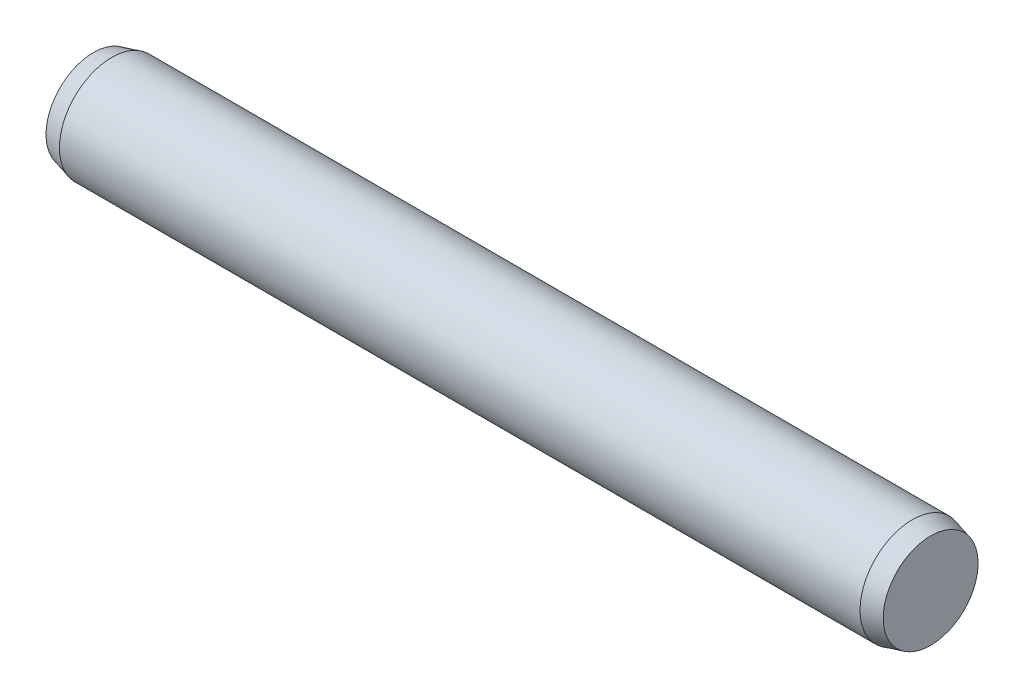
ISO-10303-21;
HEADER;
FILE_DESCRIPTION(('STEP AP214'),'2;1');
FILE_NAME('part.step','',(''),(''),'','','');
FILE_SCHEMA(('AUTOMOTIVE_DESIGN { 1 0 10303 214 1 1 1 1 }'));
ENDSEC;
DATA;
#1=APPLICATION_CONTEXT('core data for automotive mechanical design processes');
#2=APPLICATION_PROTOCOL_DEFINITION('international standard','automotive_design',2000,#1);
#3=PRODUCT_CONTEXT('',#1,'mechanical');
#4=PRODUCT('Part','Part','',(#3));
#5=PRODUCT_RELATED_PRODUCT_CATEGORY('part','',(#4));
#6=PRODUCT_DEFINITION_FORMATION('','',#4);
#7=PRODUCT_DEFINITION_CONTEXT('part definition',#1,'design');
#8=PRODUCT_DEFINITION('design','',#6,#7);
#9=PRODUCT_DEFINITION_SHAPE('','',#8);
#10=(LENGTH_UNIT() NAMED_UNIT(*) SI_UNIT(.MILLI.,.METRE.));
#11=(NAMED_UNIT(*) PLANE_ANGLE_UNIT() SI_UNIT($,.RADIAN.));
#12=(NAMED_UNIT(*) SI_UNIT($,.STERADIAN.) SOLID_ANGLE_UNIT());
#13=UNCERTAINTY_MEASURE_WITH_UNIT(LENGTH_MEASURE(1.E-05),#10,'distance_accuracy_value','');
#14=(GEOMETRIC_REPRESENTATION_CONTEXT(3) GLOBAL_UNCERTAINTY_ASSIGNED_CONTEXT((#13)) GLOBAL_UNIT_ASSIGNED_CONTEXT((#10,
#11,#12)) REPRESENTATION_CONTEXT('',''));
#15=CARTESIAN_POINT('',(0.,0.,0.));
#16=DIRECTION('',(0.,0.,1.));
#17=DIRECTION('',(1.,0.,0.));
#18=AXIS2_PLACEMENT_3D('',#15,#16,#17);
#19=CARTESIAN_POINT('',(0.,0.906217782649099,0.));
#20=DIRECTION('',(0.999999999999999,0.,0.));
#21=DIRECTION('',(0.,0.,-0.999999999999998));
#22=AXIS2_PLACEMENT_3D('',#19,#20,#21);
#23=PLANE('',#22);
#24=CARTESIAN_POINT('',(0.,0.,0.));
#25=DIRECTION('',(-0.999999999999999,0.,0.));
#26=DIRECTION('',(0.,0.,0.999999999999998));
#27=AXIS2_PLACEMENT_3D('',#24,#25,#26);
#28=CIRCLE('',#27,0.9062177826491);
#29=CARTESIAN_POINT('',(0.,0.,0.906217782649099));
#30=VERTEX_POINT('',#29);
#31=EDGE_CURVE('E60',#30,#30,#28,.T.);
#32=ORIENTED_EDGE('',*,*,#31,.T.);
#33=EDGE_LOOP('',(#32));
#34=FACE_BOUND('',#33,.T.);
#35=ADVANCED_FACE('F41',(#34),#23,.F.);
#36=CARTESIAN_POINT('',(16.,0.,0.));
#37=DIRECTION('',(-0.999999999999999,0.,0.));
#38=DIRECTION('',(0.,0.,0.999999999999998));
#39=AXIS2_PLACEMENT_3D('',#36,#37,#38);
#40=PLANE('',#39);
#41=CARTESIAN_POINT('',(16.,0.,0.));
#42=DIRECTION('',(-0.999999999999999,0.,0.));
#43=DIRECTION('',(0.,0.,0.999999999999998));
#44=AXIS2_PLACEMENT_3D('',#41,#42,#43);
#45=CIRCLE('',#44,0.90621778264911);
#46=CARTESIAN_POINT('',(16.,0.,0.906217782649108));
#47=VERTEX_POINT('',#46);
#48=EDGE_CURVE('E10',#47,#47,#45,.T.);
#49=ORIENTED_EDGE('',*,*,#48,.F.);
#50=EDGE_LOOP('',(#49));
#51=FACE_BOUND('',#50,.T.);
#52=ADVANCED_FACE('F82',(#51),#40,.F.);
#53=CARTESIAN_POINT('',(16.,0.,0.));
#54=DIRECTION('',(-0.999999999999999,0.,0.));
#55=DIRECTION('',(0.,0.,0.999999999999998));
#56=AXIS2_PLACEMENT_3D('',#53,#54,#55);
#57=CONICAL_SURFACE('',#56,0.90621778264911,0.261799387799147);
#58=CARTESIAN_POINT('',(15.65,0.,0.));
#59=DIRECTION('',(-0.999999999999999,0.,0.));
#60=DIRECTION('',(0.,0.,0.999999999999998));
#61=AXIS2_PLACEMENT_3D('',#58,#59,#60);
#62=CIRCLE('',#61,1.);
#63=CARTESIAN_POINT('',(15.65,0.,1.));
#64=VERTEX_POINT('',#63);
#65=EDGE_CURVE('E48',#64,#64,#62,.T.);
#66=CARTESIAN_POINT('',(15.65,0.,1.));
#67=CARTESIAN_POINT('',(15.6536458333333,0.,0.999023101902596));
#68=CARTESIAN_POINT('',(15.6572916666666,0.,0.998046203805191));
#69=CARTESIAN_POINT('',(15.6645833333333,0.,0.99609240761038));
#70=CARTESIAN_POINT('',(15.6682291666666,0.,0.995115509512975));
#71=CARTESIAN_POINT('',(15.6755208333333,0.,0.993161713318165));
#72=CARTESIAN_POINT('',(15.6791666666666,0.,0.99218481522076));
#73=CARTESIAN_POINT('',(15.6864583333333,0.,0.990231019025949));
#74=CARTESIAN_POINT('',(15.6901041666666,0.,0.989254120928544));
#75=CARTESIAN_POINT('',(15.6973958333333,0.,0.987300324733734));
#76=CARTESIAN_POINT('',(15.7010416666666,0.,0.986323426636329));
#77=CARTESIAN_POINT('',(15.7083333333333,0.,0.984369630441519));
#78=CARTESIAN_POINT('',(15.7119791666666,0.,0.983392732344114));
#79=CARTESIAN_POINT('',(15.7192708333333,0.,0.981438936149303));
#80=CARTESIAN_POINT('',(15.7229166666666,0.,0.980462038051898));
#81=CARTESIAN_POINT('',(15.7302083333333,0.,0.978508241857088));
#82=CARTESIAN_POINT('',(15.7338541666666,0.,0.977531343759683));
#83=CARTESIAN_POINT('',(15.7411458333333,0.,0.975577547564873));
#84=CARTESIAN_POINT('',(15.7447916666666,0.,0.974600649467467));
#85=CARTESIAN_POINT('',(15.7520833333333,0.,0.972646853272657));
#86=CARTESIAN_POINT('',(15.7557291666666,0.,0.971669955175252));
#87=CARTESIAN_POINT('',(15.7630208333333,0.,0.969716158980442));
#88=CARTESIAN_POINT('',(15.7666666666666,0.,0.968739260883036));
#89=CARTESIAN_POINT('',(15.7739583333333,0.,0.966785464688226));
#90=CARTESIAN_POINT('',(15.7776041666666,0.,0.965808566590821));
#91=CARTESIAN_POINT('',(15.7848958333333,0.,0.963854770396011));
#92=CARTESIAN_POINT('',(15.7885416666666,0.,0.962877872298605));
#93=CARTESIAN_POINT('',(15.7958333333333,0.,0.960924076103795));
#94=CARTESIAN_POINT('',(15.7994791666666,0.,0.95994717800639));
#95=CARTESIAN_POINT('',(15.8067708333333,0.,0.95799338181158));
#96=CARTESIAN_POINT('',(15.8104166666666,0.,0.957016483714175));
#97=CARTESIAN_POINT('',(15.8177083333333,0.,0.955062687519364));
#98=CARTESIAN_POINT('',(15.8213541666666,0.,0.954085789421959));
#99=CARTESIAN_POINT('',(15.8286458333333,0.,0.952131993227149));
#100=CARTESIAN_POINT('',(15.8322916666666,0.,0.951155095129744));
#101=CARTESIAN_POINT('',(15.8395833333333,0.,0.949201298934934));
#102=CARTESIAN_POINT('',(15.8432291666666,0.,0.948224400837528));
#103=CARTESIAN_POINT('',(15.8505208333333,0.,0.946270604642718));
#104=CARTESIAN_POINT('',(15.8541666666666,0.,0.945293706545313));
#105=CARTESIAN_POINT('',(15.8614583333333,0.,0.943339910350503));
#106=CARTESIAN_POINT('',(15.8651041666666,0.,0.942363012253098));
#107=CARTESIAN_POINT('',(15.8723958333333,0.,0.940409216058288));
#108=CARTESIAN_POINT('',(15.8760416666666,0.,0.939432317960882));
#109=CARTESIAN_POINT('',(15.8833333333333,0.,0.937478521766072));
#110=CARTESIAN_POINT('',(15.8869791666666,0.,0.936501623668667));
#111=CARTESIAN_POINT('',(15.8942708333333,0.,0.934547827473857));
#112=CARTESIAN_POINT('',(15.8979166666666,0.,0.933570929376451));
#113=CARTESIAN_POINT('',(15.9052083333333,0.,0.931617133181641));
#114=CARTESIAN_POINT('',(15.9088541666667,0.,0.930640235084236));
#115=CARTESIAN_POINT('',(15.9161458333333,0.,0.928686438889426));
#116=CARTESIAN_POINT('',(15.9197916666666,0.,0.927709540792021));
#117=CARTESIAN_POINT('',(15.9270833333333,0.,0.92575574459721));
#118=CARTESIAN_POINT('',(15.9307291666666,0.,0.924778846499805));
#119=CARTESIAN_POINT('',(15.9380208333333,0.,0.922825050304995));
#120=CARTESIAN_POINT('',(15.9416666666666,0.,0.92184815220759));
#121=CARTESIAN_POINT('',(15.9489583333333,0.,0.91989435601278));
#122=CARTESIAN_POINT('',(15.9526041666666,0.,0.918917457915375));
#123=CARTESIAN_POINT('',(15.9598958333333,0.,0.916963661720564));
#124=CARTESIAN_POINT('',(15.9635416666666,0.,0.915986763623159));
#125=CARTESIAN_POINT('',(15.9708333333333,0.,0.914032967428349));
#126=CARTESIAN_POINT('',(15.9744791666666,0.,0.913056069330944));
#127=CARTESIAN_POINT('',(15.9817708333333,0.,0.911102273136134));
#128=CARTESIAN_POINT('',(15.9854166666666,0.,0.910125375038728));
#129=CARTESIAN_POINT('',(15.9927083333333,0.,0.908171578843918));
#130=CARTESIAN_POINT('',(15.9963541666666,0.,0.907194680746513));
#131=CARTESIAN_POINT('',(16.,0.,0.906217782649108));
#132=B_SPLINE_CURVE_WITH_KNOTS('',3,(#66,#67,#68,#69,#70,#71,#72,#73,#74,#75,#76,#77,#78,#79,
#80,#81,#82,#83,#84,#85,#86,#87,#88,#89,#90,#91,#92,#93,#94,#95,#96,#97,#98,#99,#100,#101,#102,
#103,#104,#105,#106,#107,#108,#109,#110,#111,#112,#113,#114,#115,#116,#117,#118,#119,#120,#121,
#122,#123,#124,#125,#126,#127,#128,#129,#130,#131),.UNSPECIFIED.,.F.,.F.,(4,2,2,2,2,2,2,2,2,2,2,
2,2,2,2,2,2,2,2,2,2,2,2,2,2,2,2,2,2,2,2,2,4),(0.,0.0113233332232341,0.0226466664464682,
0.0339699996697057,0.0452933328929398,0.0566166661161739,0.0679399993394114,0.0792633325626455,
0.090586665785883,0.101909999009117,0.113233332232351,0.124556665455589,0.135879998678823,
0.147203331902057,0.158526665125294,0.169849998348529,0.181173331571766,0.192496664795,
0.203819998018234,0.215143331241472,0.226466664464706,0.23778999768794,0.249113330911177,
0.260436664134412,0.271759997357649,0.283083330580883,0.294406663804117,0.305729997027355,
0.317053330250589,0.328376663473823,0.33969999669706,0.351023329920295,0.362346663143529),.UNSPECIFIED.);
#133=EDGE_CURVE('BSEAM77',#64,#47,#132,.T.);
#134=ORIENTED_EDGE('',*,*,#65,.F.);
#135=ORIENTED_EDGE('',*,*,#48,.T.);
#136=ORIENTED_EDGE('',*,*,#133,.T.);
#137=ORIENTED_EDGE('',*,*,#133,.F.);
#138=EDGE_LOOP('',(#134,#136,#135,#137));
#139=FACE_BOUND('',#138,.T.);
#140=ADVANCED_FACE('F77',(#139),#57,.T.);
#141=CARTESIAN_POINT('',(-6.34999999999998,0.,0.));
#142=DIRECTION('',(-0.999999999999999,0.,0.));
#143=DIRECTION('',(0.,0.,0.999999999999998));
#144=AXIS2_PLACEMENT_3D('',#141,#142,#143);
#145=CYLINDRICAL_SURFACE('',#144,0.999999999999997);
#146=CARTESIAN_POINT('',(0.35,0.,0.));
#147=DIRECTION('',(-0.999999999999999,0.,0.));
#148=DIRECTION('',(0.,0.,0.999999999999998));
#149=AXIS2_PLACEMENT_3D('',#146,#147,#148);
#150=CIRCLE('',#149,0.999999999999991);
#151=CARTESIAN_POINT('',(0.35,0.,0.999999999999994));
#152=VERTEX_POINT('',#151);
#153=EDGE_CURVE('E54',#152,#152,#150,.T.);
#154=CARTESIAN_POINT('',(0.35,0.,0.999999999999994));
#155=CARTESIAN_POINT('',(0.509374999999999,0.,0.999999999999994));
#156=CARTESIAN_POINT('',(0.668749999999999,0.,0.999999999999994));
#157=CARTESIAN_POINT('',(0.987499999999998,0.,0.999999999999994));
#158=CARTESIAN_POINT('',(1.146875,0.,0.999999999999994));
#159=CARTESIAN_POINT('',(1.465625,0.,0.999999999999994));
#160=CARTESIAN_POINT('',(1.625,0.,0.999999999999994));
#161=CARTESIAN_POINT('',(1.94375,0.,0.999999999999994));
#162=CARTESIAN_POINT('',(2.103125,0.,0.999999999999994));
#163=CARTESIAN_POINT('',(2.421875,0.,0.999999999999994));
#164=CARTESIAN_POINT('',(2.58125,0.,0.999999999999994));
#165=CARTESIAN_POINT('',(2.9,0.,0.999999999999994));
#166=CARTESIAN_POINT('',(3.059375,0.,0.999999999999993));
#167=CARTESIAN_POINT('',(3.378125,0.,0.999999999999993));
#168=CARTESIAN_POINT('',(3.5375,0.,0.999999999999993));
#169=CARTESIAN_POINT('',(3.85625,0.,0.999999999999993));
#170=CARTESIAN_POINT('',(4.01562499999999,0.,0.999999999999993));
#171=CARTESIAN_POINT('',(4.33437499999999,0.,0.999999999999993));
#172=CARTESIAN_POINT('',(4.49374999999999,0.,0.999999999999993));
#173=CARTESIAN_POINT('',(4.81249999999999,0.,0.999999999999993));
#174=CARTESIAN_POINT('',(4.97187499999999,0.,0.999999999999993));
#175=CARTESIAN_POINT('',(5.29062499999999,0.,0.999999999999993));
#176=CARTESIAN_POINT('',(5.44999999999999,0.,0.999999999999993));
#177=CARTESIAN_POINT('',(5.76874999999999,0.,0.999999999999993));
#178=CARTESIAN_POINT('',(5.92812499999999,0.,0.999999999999993));
#179=CARTESIAN_POINT('',(6.24687499999999,0.,0.999999999999993));
#180=CARTESIAN_POINT('',(6.40624999999999,0.,0.999999999999993));
#181=CARTESIAN_POINT('',(6.72499999999999,0.,0.999999999999993));
#182=CARTESIAN_POINT('',(6.88437499999999,0.,0.999999999999993));
#183=CARTESIAN_POINT('',(7.20312499999999,0.,0.999999999999993));
#184=CARTESIAN_POINT('',(7.36249999999999,0.,0.999999999999993));
#185=CARTESIAN_POINT('',(7.68124999999999,0.,0.999999999999993));
#186=CARTESIAN_POINT('',(7.84062499999999,0.,0.999999999999993));
#187=CARTESIAN_POINT('',(8.15937499999999,0.,0.999999999999993));
#188=CARTESIAN_POINT('',(8.31874999999999,0.,0.999999999999992));
#189=CARTESIAN_POINT('',(8.63749999999999,0.,0.999999999999992));
#190=CARTESIAN_POINT('',(8.79687499999999,0.,0.999999999999992));
#191=CARTESIAN_POINT('',(9.11562499999999,0.,0.999999999999992));
#192=CARTESIAN_POINT('',(9.27499999999998,0.,0.999999999999992));
#193=CARTESIAN_POINT('',(9.59374999999998,0.,0.999999999999992));
#194=CARTESIAN_POINT('',(9.75312499999998,0.,0.999999999999992));
#195=CARTESIAN_POINT('',(10.071875,0.,0.999999999999992));
#196=CARTESIAN_POINT('',(10.23125,0.,0.999999999999992));
#197=CARTESIAN_POINT('',(10.55,0.,0.999999999999992));
#198=CARTESIAN_POINT('',(10.709375,0.,0.999999999999992));
#199=CARTESIAN_POINT('',(11.028125,0.,0.999999999999992));
#200=CARTESIAN_POINT('',(11.1875,0.,0.999999999999992));
#201=CARTESIAN_POINT('',(11.50625,0.,0.999999999999992));
#202=CARTESIAN_POINT('',(11.665625,0.,0.999999999999992));
#203=CARTESIAN_POINT('',(11.984375,0.,0.999999999999992));
#204=CARTESIAN_POINT('',(12.14375,0.,0.999999999999992));
#205=CARTESIAN_POINT('',(12.4625,0.,0.999999999999992));
#206=CARTESIAN_POINT('',(12.621875,0.,0.999999999999992));
#207=CARTESIAN_POINT('',(12.940625,0.,0.999999999999992));
#208=CARTESIAN_POINT('',(13.1,0.,0.999999999999992));
#209=CARTESIAN_POINT('',(13.41875,0.,0.999999999999992));
#210=CARTESIAN_POINT('',(13.578125,0.,0.999999999999992));
#211=CARTESIAN_POINT('',(13.896875,0.,0.999999999999992));
#212=CARTESIAN_POINT('',(14.05625,0.,0.999999999999992));
#213=CARTESIAN_POINT('',(14.375,0.,0.999999999999992));
#214=CARTESIAN_POINT('',(14.534375,0.,0.999999999999991));
#215=CARTESIAN_POINT('',(14.853125,0.,0.999999999999991));
#216=CARTESIAN_POINT('',(15.0125,0.,0.999999999999991));
#217=CARTESIAN_POINT('',(15.33125,0.,0.999999999999991));
#218=CARTESIAN_POINT('',(15.490625,0.,0.999999999999991));
#219=CARTESIAN_POINT('',(15.65,0.,0.999999999999991));
#220=B_SPLINE_CURVE_WITH_KNOTS('',3,(#154,#155,#156,#157,#158,#159,#160,#161,#162,#163,#164,
#165,#166,#167,#168,#169,#170,#171,#172,#173,#174,#175,#176,#177,#178,#179,#180,#181,#182,#183,
#184,#185,#186,#187,#188,#189,#190,#191,#192,#193,#194,#195,#196,#197,#198,#199,#200,#201,#202,
#203,#204,#205,#206,#207,#208,#209,#210,#211,#212,#213,#214,#215,#216,#217,#218,#219),
.UNSPECIFIED.,.F.,.F.,(4,2,2,2,2,2,2,2,2,2,2,2,2,2,2,2,2,2,2,2,2,2,2,2,2,2,2,2,2,2,2,2,4),(0.,
0.478124999999999,0.956249999999998,1.434375,1.9125,2.390625,2.86875,3.346875,3.82499999999999,
4.30312499999999,4.78124999999999,5.25937499999999,5.73749999999999,6.21562499999999,
6.69374999999999,7.17187499999999,7.64999999999999,8.12812499999999,8.60624999999999,
9.08437499999999,9.56249999999998,10.040625,10.51875,10.996875,11.475,11.953125,12.43125,
12.909375,13.3875,13.865625,14.34375,14.821875,15.3),.UNSPECIFIED.);
#221=EDGE_CURVE('BSEAM72',#152,#64,#220,.T.);
#222=ORIENTED_EDGE('',*,*,#153,.F.);
#223=ORIENTED_EDGE('',*,*,#65,.T.);
#224=ORIENTED_EDGE('',*,*,#221,.T.);
#225=ORIENTED_EDGE('',*,*,#221,.F.);
#226=EDGE_LOOP('',(#222,#224,#223,#225));
#227=FACE_BOUND('',#226,.T.);
#228=ADVANCED_FACE('F72',(#227),#145,.T.);
#229=CARTESIAN_POINT('',(0.35,0.,0.));
#230=DIRECTION('',(0.999999999999999,0.,0.));
#231=DIRECTION('',(0.,0.,-0.999999999999998));
#232=AXIS2_PLACEMENT_3D('',#229,#230,#231);
#233=CONICAL_SURFACE('',#232,0.999999999999991,0.261799387799144);
#234=ORIENTED_EDGE('',*,*,#31,.F.);
#235=EDGE_LOOP('',(#234));
#236=FACE_BOUND('',#235,.T.);
#237=ORIENTED_EDGE('',*,*,#153,.T.);
#238=EDGE_LOOP('',(#237));
#239=FACE_BOUND('',#238,.T.);
#240=ADVANCED_FACE('F69',(#236,#239),#233,.T.);
#241=CLOSED_SHELL('',(#35,#52,#140,#228,#240));
#242=MANIFOLD_SOLID_BREP('B2',#241);
#243=ADVANCED_BREP_SHAPE_REPRESENTATION('',(#18,#242),#14);
#244=SHAPE_DEFINITION_REPRESENTATION(#9,#243);
ENDSEC;
END-ISO-10303-21;
